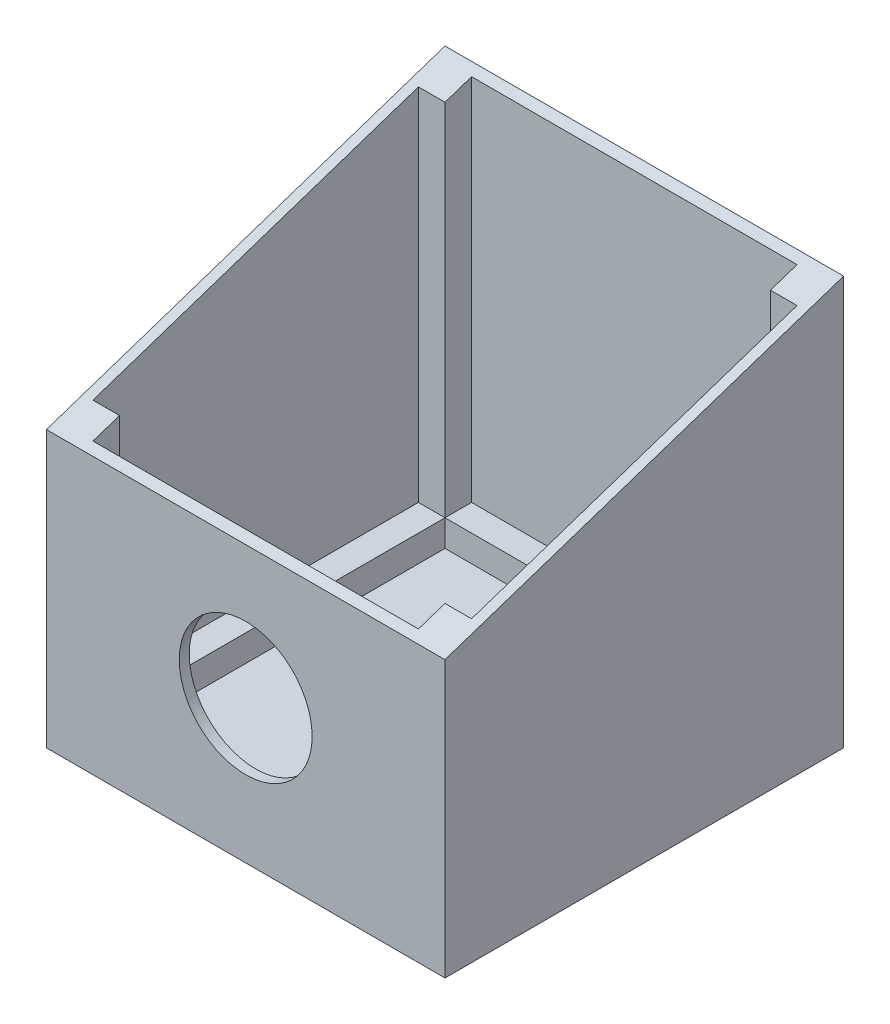
ISO-10303-21;
HEADER;
FILE_DESCRIPTION(('STEP AP214'),'2;1');
FILE_NAME('part.step','',(''),(''),'','','');
FILE_SCHEMA(('AUTOMOTIVE_DESIGN { 1 0 10303 214 1 1 1 1 }'));
ENDSEC;
DATA;
#1=APPLICATION_CONTEXT('core data for automotive mechanical design processes');
#2=APPLICATION_PROTOCOL_DEFINITION('international standard','automotive_design',2000,#1);
#3=PRODUCT_CONTEXT('',#1,'mechanical');
#4=PRODUCT('Part','Part','',(#3));
#5=PRODUCT_RELATED_PRODUCT_CATEGORY('part','',(#4));
#6=PRODUCT_DEFINITION_FORMATION('','',#4);
#7=PRODUCT_DEFINITION_CONTEXT('part definition',#1,'design');
#8=PRODUCT_DEFINITION('design','',#6,#7);
#9=PRODUCT_DEFINITION_SHAPE('','',#8);
#10=(LENGTH_UNIT() NAMED_UNIT(*) SI_UNIT(.MILLI.,.METRE.));
#11=(NAMED_UNIT(*) PLANE_ANGLE_UNIT() SI_UNIT($,.RADIAN.));
#12=(NAMED_UNIT(*) SI_UNIT($,.STERADIAN.) SOLID_ANGLE_UNIT());
#13=UNCERTAINTY_MEASURE_WITH_UNIT(LENGTH_MEASURE(1.E-05),#10,'distance_accuracy_value','');
#14=(GEOMETRIC_REPRESENTATION_CONTEXT(3) GLOBAL_UNCERTAINTY_ASSIGNED_CONTEXT((#13)) GLOBAL_UNIT_ASSIGNED_CONTEXT((#10,
#11,#12)) REPRESENTATION_CONTEXT('',''));
#15=CARTESIAN_POINT('',(0.,0.,0.));
#16=DIRECTION('',(0.,0.,1.));
#17=DIRECTION('',(1.,0.,0.));
#18=AXIS2_PLACEMENT_3D('',#15,#16,#17);
#19=CARTESIAN_POINT('',(0.,120.,-106.));
#20=DIRECTION('',(0.,0.,1.));
#21=DIRECTION('',(1.,0.,0.));
#22=AXIS2_PLACEMENT_3D('',#19,#20,#21);
#23=PLANE('',#22);
#24=DIRECTION('',(0.,-1.,0.));
#25=VECTOR('',#24,1.);
#26=CARTESIAN_POINT('',(7.99999999999999,8.,-106.));
#27=LINE('',#26,#25);
#28=CARTESIAN_POINT('',(7.99999999999999,7.99999999999999,-106.));
#29=VERTEX_POINT('',#28);
#30=CARTESIAN_POINT('',(7.99999999999999,0.,-106.));
#31=VERTEX_POINT('',#30);
#32=EDGE_CURVE('E173',#29,#31,#27,.T.);
#33=ORIENTED_EDGE('',*,*,#32,.T.);
#34=DIRECTION('',(-1.,0.,0.));
#35=VECTOR('',#34,1.);
#36=CARTESIAN_POINT('',(0.,0.,-106.));
#37=LINE('',#36,#35);
#38=CARTESIAN_POINT('',(106.,0.,-106.));
#39=VERTEX_POINT('',#38);
#40=EDGE_CURVE('E158',#39,#31,#37,.T.);
#41=ORIENTED_EDGE('',*,*,#40,.F.);
#42=DIRECTION('',(0.,-1.,0.));
#43=VECTOR('',#42,1.);
#44=CARTESIAN_POINT('',(106.,8.,-106.));
#45=LINE('',#44,#43);
#46=CARTESIAN_POINT('',(106.,8.00000000000001,-106.));
#47=VERTEX_POINT('',#46);
#48=EDGE_CURVE('E207',#47,#39,#45,.T.);
#49=ORIENTED_EDGE('',*,*,#48,.F.);
#50=DIRECTION('',(-1.,0.,0.));
#51=VECTOR('',#50,1.);
#52=CARTESIAN_POINT('',(0.,8.,-106.));
#53=LINE('',#52,#51);
#54=EDGE_CURVE('E175',#47,#29,#53,.T.);
#55=ORIENTED_EDGE('',*,*,#54,.T.);
#56=EDGE_LOOP('',(#33,#41,#49,#55));
#57=FACE_BOUND('',#56,.T.);
#58=ADVANCED_FACE('F32',(#57),#23,.T.);
#59=CARTESIAN_POINT('',(0.,120.,-7.99999999999999));
#60=DIRECTION('',(0.,0.,-1.));
#61=DIRECTION('',(-1.,0.,0.));
#62=AXIS2_PLACEMENT_3D('',#59,#60,#61);
#63=PLANE('',#62);
#64=DIRECTION('',(0.,-1.,0.));
#65=VECTOR('',#64,1.);
#66=CARTESIAN_POINT('',(8.,8.,-7.99999999999999));
#67=LINE('',#66,#65);
#68=CARTESIAN_POINT('',(8.,8.00000000000001,-7.99999999999999));
#69=VERTEX_POINT('',#68);
#70=CARTESIAN_POINT('',(7.99999999999999,0.,-7.99999999999999));
#71=VERTEX_POINT('',#70);
#72=EDGE_CURVE('E179',#69,#71,#67,.T.);
#73=ORIENTED_EDGE('',*,*,#72,.F.);
#74=DIRECTION('',(1.,0.,0.));
#75=VECTOR('',#74,1.);
#76=CARTESIAN_POINT('',(0.,8.,-7.99999999999998));
#77=LINE('',#76,#75);
#78=CARTESIAN_POINT('',(106.,8.00000000000001,-8.));
#79=VERTEX_POINT('',#78);
#80=EDGE_CURVE('E183',#69,#79,#77,.T.);
#81=ORIENTED_EDGE('',*,*,#80,.T.);
#82=DIRECTION('',(0.,-1.,0.));
#83=VECTOR('',#82,1.);
#84=CARTESIAN_POINT('',(106.,8.,-8.));
#85=LINE('',#84,#83);
#86=CARTESIAN_POINT('',(106.,0.,-8.));
#87=VERTEX_POINT('',#86);
#88=EDGE_CURVE('E187',#79,#87,#85,.T.);
#89=ORIENTED_EDGE('',*,*,#88,.T.);
#90=DIRECTION('',(1.,0.,0.));
#91=VECTOR('',#90,1.);
#92=CARTESIAN_POINT('',(0.,0.,-7.99999999999999));
#93=LINE('',#92,#91);
#94=EDGE_CURVE('E168',#71,#87,#93,.T.);
#95=ORIENTED_EDGE('',*,*,#94,.F.);
#96=EDGE_LOOP('',(#73,#81,#89,#95));
#97=FACE_BOUND('',#96,.T.);
#98=ADVANCED_FACE('F354',(#97),#63,.T.);
#99=CARTESIAN_POINT('',(106.,120.,0.));
#100=DIRECTION('',(-1.,0.,0.));
#101=DIRECTION('',(0.,0.,1.));
#102=AXIS2_PLACEMENT_3D('',#99,#100,#101);
#103=PLANE('',#102);
#104=ORIENTED_EDGE('',*,*,#88,.F.);
#105=DIRECTION('',(0.,0.,-1.));
#106=VECTOR('',#105,1.);
#107=CARTESIAN_POINT('',(106.,8.,0.));
#108=LINE('',#107,#106);
#109=EDGE_CURVE('E201',#79,#47,#108,.T.);
#110=ORIENTED_EDGE('',*,*,#109,.T.);
#111=ORIENTED_EDGE('',*,*,#48,.T.);
#112=DIRECTION('',(0.,0.,-1.));
#113=VECTOR('',#112,1.);
#114=CARTESIAN_POINT('',(106.,0.,0.));
#115=LINE('',#114,#113);
#116=EDGE_CURVE('E165',#87,#39,#115,.T.);
#117=ORIENTED_EDGE('',*,*,#116,.F.);
#118=EDGE_LOOP('',(#104,#110,#111,#117));
#119=FACE_BOUND('',#118,.T.);
#120=ADVANCED_FACE('F361',(#119),#103,.T.);
#121=DIRECTION('',(-1.,0.,0.));
#122=VECTOR('',#121,1.);
#123=CARTESIAN_POINT('',(0.,8.,-106.));
#124=LINE('',#123,#122);
#125=CARTESIAN_POINT('',(0.,8.00000000000001,-106.));
#126=VERTEX_POINT('',#125);
#127=EDGE_CURVE('E184',#29,#126,#124,.T.);
#128=ORIENTED_EDGE('',*,*,#127,.F.);
#129=DIRECTION('',(0.,-1.,0.));
#130=VECTOR('',#129,1.);
#131=CARTESIAN_POINT('',(7.99999999999999,120.,-106.));
#132=LINE('',#131,#130);
#133=CARTESIAN_POINT('',(7.99999999999999,116.333333333333,-106.));
#134=VERTEX_POINT('',#133);
#135=EDGE_CURVE('E309',#134,#29,#132,.T.);
#136=ORIENTED_EDGE('',*,*,#135,.F.);
#137=DIRECTION('',(1.,0.,0.));
#138=VECTOR('',#137,1.);
#139=CARTESIAN_POINT('',(0.,116.333333333333,-106.));
#140=LINE('',#139,#138);
#141=CARTESIAN_POINT('',(0.,116.333333333333,-106.));
#142=VERTEX_POINT('',#141);
#143=EDGE_CURVE('E268',#142,#134,#140,.T.);
#144=ORIENTED_EDGE('',*,*,#143,.F.);
#145=DIRECTION('',(0.,-1.,0.));
#146=VECTOR('',#145,1.);
#147=CARTESIAN_POINT('',(0.,120.,-106.));
#148=LINE('',#147,#146);
#149=EDGE_CURVE('E307',#142,#126,#148,.T.);
#150=ORIENTED_EDGE('',*,*,#149,.T.);
#151=EDGE_LOOP('',(#128,#136,#144,#150));
#152=FACE_BOUND('',#151,.T.);
#153=ADVANCED_FACE('F356',(#152),#23,.T.);
#154=CARTESIAN_POINT('',(-3.,120.,3.));
#155=DIRECTION('',(0.,0.,-1.));
#156=DIRECTION('',(-1.,0.,0.));
#157=AXIS2_PLACEMENT_3D('',#154,#155,#156);
#158=PLANE('',#157);
#159=DIRECTION('',(0.,-1.,0.));
#160=VECTOR('',#159,1.);
#161=CARTESIAN_POINT('',(117.,120.,3.));
#162=LINE('',#161,#160);
#163=CARTESIAN_POINT('',(117.,80.,3.));
#164=VERTEX_POINT('',#163);
#165=CARTESIAN_POINT('',(117.,-3.,3.));
#166=VERTEX_POINT('',#165);
#167=EDGE_CURVE('E318',#164,#166,#162,.T.);
#168=ORIENTED_EDGE('',*,*,#167,.F.);
#169=DIRECTION('',(1.,0.,0.));
#170=VECTOR('',#169,1.);
#171=CARTESIAN_POINT('',(-120.,80.,3.));
#172=LINE('',#171,#170);
#173=CARTESIAN_POINT('',(-3.,80.,3.));
#174=VERTEX_POINT('',#173);
#175=EDGE_CURVE('E248',#174,#164,#172,.T.);
#176=ORIENTED_EDGE('',*,*,#175,.F.);
#177=DIRECTION('',(0.,-1.,0.));
#178=VECTOR('',#177,1.);
#179=CARTESIAN_POINT('',(-3.,120.,3.));
#180=LINE('',#179,#178);
#181=CARTESIAN_POINT('',(-3.,-3.,3.));
#182=VERTEX_POINT('',#181);
#183=EDGE_CURVE('E40',#174,#182,#180,.T.);
#184=ORIENTED_EDGE('',*,*,#183,.T.);
#185=DIRECTION('',(1.,0.,0.));
#186=VECTOR('',#185,1.);
#187=CARTESIAN_POINT('',(-3.,-3.,3.));
#188=LINE('',#187,#186);
#189=EDGE_CURVE('E239',#182,#166,#188,.T.);
#190=ORIENTED_EDGE('',*,*,#189,.T.);
#191=EDGE_LOOP('',(#168,#176,#184,#190));
#192=FACE_BOUND('',#191,.T.);
#193=CARTESIAN_POINT('',(57.,40.,3.));
#194=DIRECTION('',(0.,0.,-1.));
#195=DIRECTION('',(-1.,0.,0.));
#196=AXIS2_PLACEMENT_3D('',#193,#194,#195);
#197=CIRCLE('',#196,20.);
#198=CARTESIAN_POINT('',(37.,40.,3.));
#199=VERTEX_POINT('',#198);
#200=EDGE_CURVE('E245',#199,#199,#197,.F.);
#201=ORIENTED_EDGE('',*,*,#200,.F.);
#202=EDGE_LOOP('',(#201));
#203=FACE_BOUND('',#202,.T.);
#204=ADVANCED_FACE('F323',(#192,#203),#158,.F.);
#205=CARTESIAN_POINT('',(8.,120.,0.));
#206=DIRECTION('',(0.,0.,-1.));
#207=DIRECTION('',(-1.,0.,0.));
#208=AXIS2_PLACEMENT_3D('',#205,#206,#207);
#209=PLANE('',#208);
#210=DIRECTION('',(1.,0.,0.));
#211=VECTOR('',#210,1.);
#212=CARTESIAN_POINT('',(0.,8.,0.));
#213=LINE('',#212,#211);
#214=CARTESIAN_POINT('',(8.,8.00000000000001,0.));
#215=VERTEX_POINT('',#214);
#216=CARTESIAN_POINT('',(106.,8.00000000000001,0.));
#217=VERTEX_POINT('',#216);
#218=EDGE_CURVE('E202',#215,#217,#213,.T.);
#219=ORIENTED_EDGE('',*,*,#218,.F.);
#220=DIRECTION('',(0.,-1.,0.));
#221=VECTOR('',#220,1.);
#222=CARTESIAN_POINT('',(8.,120.,0.));
#223=LINE('',#222,#221);
#224=CARTESIAN_POINT('',(8.,81.,0.));
#225=VERTEX_POINT('',#224);
#226=EDGE_CURVE('E300',#225,#215,#223,.T.);
#227=ORIENTED_EDGE('',*,*,#226,.F.);
#228=DIRECTION('',(-1.,0.,0.));
#229=VECTOR('',#228,1.);
#230=CARTESIAN_POINT('',(8.,81.,0.));
#231=LINE('',#230,#229);
#232=CARTESIAN_POINT('',(106.,81.,0.));
#233=VERTEX_POINT('',#232);
#234=EDGE_CURVE('E260',#233,#225,#231,.T.);
#235=ORIENTED_EDGE('',*,*,#234,.F.);
#236=DIRECTION('',(0.,-1.,0.));
#237=VECTOR('',#236,1.);
#238=CARTESIAN_POINT('',(106.,120.,0.));
#239=LINE('',#238,#237);
#240=EDGE_CURVE('E297',#233,#217,#239,.T.);
#241=ORIENTED_EDGE('',*,*,#240,.T.);
#242=EDGE_LOOP('',(#219,#227,#235,#241));
#243=FACE_BOUND('',#242,.T.);
#244=CARTESIAN_POINT('',(57.,40.,0.));
#245=DIRECTION('',(0.,0.,1.));
#246=DIRECTION('',(1.,0.,0.));
#247=AXIS2_PLACEMENT_3D('',#244,#245,#246);
#248=CIRCLE('',#247,20.);
#249=CARTESIAN_POINT('',(77.,40.,0.));
#250=VERTEX_POINT('',#249);
#251=EDGE_CURVE('E242',#250,#250,#248,.T.);
#252=ORIENTED_EDGE('',*,*,#251,.T.);
#253=EDGE_LOOP('',(#252));
#254=FACE_BOUND('',#253,.T.);
#255=ADVANCED_FACE('F398',(#243,#254),#209,.T.);
#256=CARTESIAN_POINT('',(-3.,120.,3.));
#257=DIRECTION('',(1.,0.,0.));
#258=DIRECTION('',(0.,0.,-1.));
#259=AXIS2_PLACEMENT_3D('',#256,#257,#258);
#260=PLANE('',#259);
#261=ORIENTED_EDGE('',*,*,#183,.F.);
#262=DIRECTION('',(0.,0.316227766016838,-0.948683298050514));
#263=VECTOR('',#262,1.);
#264=CARTESIAN_POINT('',(-3.,84.,-8.99999999999999));
#265=LINE('',#264,#263);
#266=CARTESIAN_POINT('',(-3.,120.,-117.));
#267=VERTEX_POINT('',#266);
#268=EDGE_CURVE('E169',#174,#267,#265,.T.);
#269=ORIENTED_EDGE('',*,*,#268,.T.);
#270=DIRECTION('',(0.,-1.,0.));
#271=VECTOR('',#270,1.);
#272=CARTESIAN_POINT('',(-3.,120.,-117.));
#273=LINE('',#272,#271);
#274=CARTESIAN_POINT('',(-3.,-3.,-117.));
#275=VERTEX_POINT('',#274);
#276=EDGE_CURVE('E314',#267,#275,#273,.T.);
#277=ORIENTED_EDGE('',*,*,#276,.T.);
#278=DIRECTION('',(0.,0.,1.));
#279=VECTOR('',#278,1.);
#280=CARTESIAN_POINT('',(-3.,-3.,-117.));
#281=LINE('',#280,#279);
#282=EDGE_CURVE('E236',#275,#182,#281,.T.);
#283=ORIENTED_EDGE('',*,*,#282,.T.);
#284=EDGE_LOOP('',(#261,#269,#277,#283));
#285=FACE_BOUND('',#284,.T.);
#286=ADVANCED_FACE('F34',(#285),#260,.F.);
#287=CARTESIAN_POINT('',(117.,120.,3.));
#288=DIRECTION('',(-1.,0.,0.));
#289=DIRECTION('',(0.,0.,1.));
#290=AXIS2_PLACEMENT_3D('',#287,#288,#289);
#291=PLANE('',#290);
#292=DIRECTION('',(0.,-1.,0.));
#293=VECTOR('',#292,1.);
#294=CARTESIAN_POINT('',(117.,120.,-117.));
#295=LINE('',#294,#293);
#296=CARTESIAN_POINT('',(117.,120.,-117.));
#297=VERTEX_POINT('',#296);
#298=CARTESIAN_POINT('',(117.,-3.,-117.));
#299=VERTEX_POINT('',#298);
#300=EDGE_CURVE('E316',#297,#299,#295,.T.);
#301=ORIENTED_EDGE('',*,*,#300,.F.);
#302=DIRECTION('',(0.,-0.316227766016838,0.948683298050514));
#303=VECTOR('',#302,1.);
#304=CARTESIAN_POINT('',(117.,84.,-8.99999999999999));
#305=LINE('',#304,#303);
#306=EDGE_CURVE('E272',#297,#164,#305,.T.);
#307=ORIENTED_EDGE('',*,*,#306,.T.);
#308=ORIENTED_EDGE('',*,*,#167,.T.);
#309=DIRECTION('',(0.,0.,-1.));
#310=VECTOR('',#309,1.);
#311=CARTESIAN_POINT('',(117.,-3.,3.));
#312=LINE('',#311,#310);
#313=EDGE_CURVE('E230',#166,#299,#312,.T.);
#314=ORIENTED_EDGE('',*,*,#313,.T.);
#315=EDGE_LOOP('',(#301,#307,#308,#314));
#316=FACE_BOUND('',#315,.T.);
#317=ADVANCED_FACE('F335',(#316),#291,.F.);
#318=CARTESIAN_POINT('',(-3.,120.,-117.));
#319=DIRECTION('',(0.,0.,1.));
#320=DIRECTION('',(1.,0.,0.));
#321=AXIS2_PLACEMENT_3D('',#318,#319,#320);
#322=PLANE('',#321);
#323=ORIENTED_EDGE('',*,*,#300,.T.);
#324=DIRECTION('',(-1.,0.,0.));
#325=VECTOR('',#324,1.);
#326=CARTESIAN_POINT('',(117.,-3.,-117.));
#327=LINE('',#326,#325);
#328=EDGE_CURVE('E233',#299,#275,#327,.T.);
#329=ORIENTED_EDGE('',*,*,#328,.T.);
#330=ORIENTED_EDGE('',*,*,#276,.F.);
#331=DIRECTION('',(-1.,0.,0.));
#332=VECTOR('',#331,1.);
#333=CARTESIAN_POINT('',(-3.,120.,-117.));
#334=LINE('',#333,#332);
#335=EDGE_CURVE('E312',#297,#267,#334,.T.);
#336=ORIENTED_EDGE('',*,*,#335,.F.);
#337=EDGE_LOOP('',(#323,#329,#330,#336));
#338=FACE_BOUND('',#337,.T.);
#339=ADVANCED_FACE('F340',(#338),#322,.F.);
#340=CARTESIAN_POINT('',(8.,120.,-114.));
#341=DIRECTION('',(1.,0.,0.));
#342=DIRECTION('',(0.,0.,-1.));
#343=AXIS2_PLACEMENT_3D('',#340,#341,#342);
#344=PLANE('',#343);
#345=DIRECTION('',(0.,0.,1.));
#346=VECTOR('',#345,1.);
#347=CARTESIAN_POINT('',(7.9999999999998,8.,0.));
#348=LINE('',#347,#346);
#349=CARTESIAN_POINT('',(8.,8.00000000000001,-114.));
#350=VERTEX_POINT('',#349);
#351=EDGE_CURVE('E223',#350,#29,#348,.T.);
#352=ORIENTED_EDGE('',*,*,#351,.F.);
#353=DIRECTION('',(0.,-1.,0.));
#354=VECTOR('',#353,1.);
#355=CARTESIAN_POINT('',(8.,120.,-114.));
#356=LINE('',#355,#354);
#357=CARTESIAN_POINT('',(8.,119.,-114.));
#358=VERTEX_POINT('',#357);
#359=EDGE_CURVE('E279',#358,#350,#356,.T.);
#360=ORIENTED_EDGE('',*,*,#359,.F.);
#361=DIRECTION('',(0.,0.316227766016838,-0.948683298050514));
#362=VECTOR('',#361,1.);
#363=CARTESIAN_POINT('',(8.,119.1,-114.3));
#364=LINE('',#363,#362);
#365=EDGE_CURVE('E270',#134,#358,#364,.T.);
#366=ORIENTED_EDGE('',*,*,#365,.F.);
#367=ORIENTED_EDGE('',*,*,#135,.T.);
#368=EDGE_LOOP('',(#352,#360,#366,#367));
#369=FACE_BOUND('',#368,.T.);
#370=ADVANCED_FACE('F342',(#369),#344,.T.);
#371=DIRECTION('',(-1.,0.,0.));
#372=VECTOR('',#371,1.);
#373=CARTESIAN_POINT('',(0.,8.,-106.));
#374=LINE('',#373,#372);
#375=CARTESIAN_POINT('',(114.,8.00000000000001,-106.));
#376=VERTEX_POINT('',#375);
#377=EDGE_CURVE('E214',#376,#47,#374,.T.);
#378=ORIENTED_EDGE('',*,*,#377,.F.);
#379=DIRECTION('',(0.,-1.,0.));
#380=VECTOR('',#379,1.);
#381=CARTESIAN_POINT('',(114.,120.,-106.));
#382=LINE('',#381,#380);
#383=CARTESIAN_POINT('',(114.,116.333333333333,-106.));
#384=VERTEX_POINT('',#383);
#385=EDGE_CURVE('E288',#384,#376,#382,.T.);
#386=ORIENTED_EDGE('',*,*,#385,.F.);
#387=DIRECTION('',(1.,0.,0.));
#388=VECTOR('',#387,1.);
#389=CARTESIAN_POINT('',(114.,116.333333333333,-106.));
#390=LINE('',#389,#388);
#391=CARTESIAN_POINT('',(106.,116.333333333333,-106.));
#392=VERTEX_POINT('',#391);
#393=EDGE_CURVE('E252',#392,#384,#390,.T.);
#394=ORIENTED_EDGE('',*,*,#393,.F.);
#395=DIRECTION('',(0.,-1.,0.));
#396=VECTOR('',#395,1.);
#397=CARTESIAN_POINT('',(106.,120.,-106.));
#398=LINE('',#397,#396);
#399=EDGE_CURVE('E285',#392,#47,#398,.T.);
#400=ORIENTED_EDGE('',*,*,#399,.T.);
#401=EDGE_LOOP('',(#378,#386,#394,#400));
#402=FACE_BOUND('',#401,.T.);
#403=ADVANCED_FACE('F349',(#402),#23,.T.);
#404=CARTESIAN_POINT('',(0.,120.,-7.99999999999999));
#405=DIRECTION('',(1.,0.,0.));
#406=DIRECTION('',(0.,0.,-1.));
#407=AXIS2_PLACEMENT_3D('',#404,#405,#406);
#408=PLANE('',#407);
#409=DIRECTION('',(0.,0.,1.));
#410=VECTOR('',#409,1.);
#411=CARTESIAN_POINT('',(0.,8.,0.));
#412=LINE('',#411,#410);
#413=CARTESIAN_POINT('',(0.,8.00000000000001,-7.99999999999999));
#414=VERTEX_POINT('',#413);
#415=EDGE_CURVE('E47',#126,#414,#412,.T.);
#416=ORIENTED_EDGE('',*,*,#415,.F.);
#417=ORIENTED_EDGE('',*,*,#149,.F.);
#418=DIRECTION('',(0.,0.316227766016838,-0.948683298050514));
#419=VECTOR('',#418,1.);
#420=CARTESIAN_POINT('',(0.,87.3,-18.9));
#421=LINE('',#420,#419);
#422=CARTESIAN_POINT('',(0.,83.6666666666667,-7.99999999999999));
#423=VERTEX_POINT('',#422);
#424=EDGE_CURVE('E266',#423,#142,#421,.T.);
#425=ORIENTED_EDGE('',*,*,#424,.F.);
#426=DIRECTION('',(0.,-1.,0.));
#427=VECTOR('',#426,1.);
#428=CARTESIAN_POINT('',(0.,120.,-7.99999999999999));
#429=LINE('',#428,#427);
#430=EDGE_CURVE('E305',#423,#414,#429,.T.);
#431=ORIENTED_EDGE('',*,*,#430,.T.);
#432=EDGE_LOOP('',(#416,#417,#425,#431));
#433=FACE_BOUND('',#432,.T.);
#434=ADVANCED_FACE('F368',(#433),#408,.T.);
#435=DIRECTION('',(1.,0.,0.));
#436=VECTOR('',#435,1.);
#437=CARTESIAN_POINT('',(0.,8.,-7.99999999999999));
#438=LINE('',#437,#436);
#439=EDGE_CURVE('E55',#414,#69,#438,.T.);
#440=ORIENTED_EDGE('',*,*,#439,.F.);
#441=ORIENTED_EDGE('',*,*,#430,.F.);
#442=DIRECTION('',(-1.,0.,0.));
#443=VECTOR('',#442,1.);
#444=CARTESIAN_POINT('',(0.,83.6666666666667,-7.99999999999999));
#445=LINE('',#444,#443);
#446=CARTESIAN_POINT('',(8.,83.6666666666667,-7.99999999999999));
#447=VERTEX_POINT('',#446);
#448=EDGE_CURVE('E264',#447,#423,#445,.T.);
#449=ORIENTED_EDGE('',*,*,#448,.F.);
#450=DIRECTION('',(0.,-1.,0.));
#451=VECTOR('',#450,1.);
#452=CARTESIAN_POINT('',(8.,120.,-7.99999999999999));
#453=LINE('',#452,#451);
#454=EDGE_CURVE('E303',#447,#69,#453,.T.);
#455=ORIENTED_EDGE('',*,*,#454,.T.);
#456=EDGE_LOOP('',(#440,#441,#449,#455));
#457=FACE_BOUND('',#456,.T.);
#458=ADVANCED_FACE('F364',(#457),#63,.T.);
#459=CARTESIAN_POINT('',(8.,120.,0.));
#460=DIRECTION('',(1.,0.,0.));
#461=DIRECTION('',(0.,0.,-1.));
#462=AXIS2_PLACEMENT_3D('',#459,#460,#461);
#463=PLANE('',#462);
#464=DIRECTION('',(0.,0.,1.));
#465=VECTOR('',#464,1.);
#466=CARTESIAN_POINT('',(8.,8.,0.));
#467=LINE('',#466,#465);
#468=EDGE_CURVE('E197',#69,#215,#467,.T.);
#469=ORIENTED_EDGE('',*,*,#468,.F.);
#470=ORIENTED_EDGE('',*,*,#454,.F.);
#471=DIRECTION('',(0.,0.316227766016838,-0.948683298050514));
#472=VECTOR('',#471,1.);
#473=CARTESIAN_POINT('',(8.,84.9,-11.7));
#474=LINE('',#473,#472);
#475=EDGE_CURVE('E262',#225,#447,#474,.T.);
#476=ORIENTED_EDGE('',*,*,#475,.F.);
#477=ORIENTED_EDGE('',*,*,#226,.T.);
#478=EDGE_LOOP('',(#469,#470,#476,#477));
#479=FACE_BOUND('',#478,.T.);
#480=ADVANCED_FACE('F402',(#479),#463,.T.);
#481=DIRECTION('',(0.,0.,-1.));
#482=VECTOR('',#481,1.);
#483=CARTESIAN_POINT('',(106.,8.,0.));
#484=LINE('',#483,#482);
#485=EDGE_CURVE('E198',#217,#79,#484,.T.);
#486=ORIENTED_EDGE('',*,*,#485,.F.);
#487=ORIENTED_EDGE('',*,*,#240,.F.);
#488=DIRECTION('',(0.,-0.316227766016838,0.948683298050514));
#489=VECTOR('',#488,1.);
#490=CARTESIAN_POINT('',(106.,84.9,-11.7));
#491=LINE('',#490,#489);
#492=CARTESIAN_POINT('',(106.,83.6666666666667,-8.));
#493=VERTEX_POINT('',#492);
#494=EDGE_CURVE('E258',#493,#233,#491,.T.);
#495=ORIENTED_EDGE('',*,*,#494,.F.);
#496=DIRECTION('',(0.,-1.,0.));
#497=VECTOR('',#496,1.);
#498=CARTESIAN_POINT('',(106.,120.,-8.));
#499=LINE('',#498,#497);
#500=EDGE_CURVE('E294',#493,#79,#499,.T.);
#501=ORIENTED_EDGE('',*,*,#500,.T.);
#502=EDGE_LOOP('',(#486,#487,#495,#501));
#503=FACE_BOUND('',#502,.T.);
#504=ADVANCED_FACE('F391',(#503),#103,.T.);
#505=CARTESIAN_POINT('',(114.,120.,-8.));
#506=DIRECTION('',(0.,0.,-1.));
#507=DIRECTION('',(-1.,0.,0.));
#508=AXIS2_PLACEMENT_3D('',#505,#506,#507);
#509=PLANE('',#508);
#510=DIRECTION('',(1.,0.,0.));
#511=VECTOR('',#510,1.);
#512=CARTESIAN_POINT('',(0.,8.,-8.));
#513=LINE('',#512,#511);
#514=CARTESIAN_POINT('',(114.,8.00000000000001,-8.));
#515=VERTEX_POINT('',#514);
#516=EDGE_CURVE('E210',#79,#515,#513,.T.);
#517=ORIENTED_EDGE('',*,*,#516,.F.);
#518=ORIENTED_EDGE('',*,*,#500,.F.);
#519=DIRECTION('',(-1.,0.,0.));
#520=VECTOR('',#519,1.);
#521=CARTESIAN_POINT('',(114.,83.6666666666667,-8.));
#522=LINE('',#521,#520);
#523=CARTESIAN_POINT('',(114.,83.6666666666667,-8.));
#524=VERTEX_POINT('',#523);
#525=EDGE_CURVE('E256',#524,#493,#522,.T.);
#526=ORIENTED_EDGE('',*,*,#525,.F.);
#527=DIRECTION('',(0.,-1.,0.));
#528=VECTOR('',#527,1.);
#529=CARTESIAN_POINT('',(114.,120.,-8.));
#530=LINE('',#529,#528);
#531=EDGE_CURVE('E291',#524,#515,#530,.T.);
#532=ORIENTED_EDGE('',*,*,#531,.T.);
#533=EDGE_LOOP('',(#517,#518,#526,#532));
#534=FACE_BOUND('',#533,.T.);
#535=ADVANCED_FACE('F387',(#534),#509,.T.);
#536=CARTESIAN_POINT('',(114.,120.,-8.));
#537=DIRECTION('',(-1.,0.,0.));
#538=DIRECTION('',(0.,0.,1.));
#539=AXIS2_PLACEMENT_3D('',#536,#537,#538);
#540=PLANE('',#539);
#541=DIRECTION('',(0.,0.,-1.));
#542=VECTOR('',#541,1.);
#543=CARTESIAN_POINT('',(114.,8.,0.));
#544=LINE('',#543,#542);
#545=EDGE_CURVE('E209',#515,#376,#544,.T.);
#546=ORIENTED_EDGE('',*,*,#545,.F.);
#547=ORIENTED_EDGE('',*,*,#531,.F.);
#548=DIRECTION('',(0.,-0.316227766016838,0.948683298050514));
#549=VECTOR('',#548,1.);
#550=CARTESIAN_POINT('',(114.,87.3,-18.9));
#551=LINE('',#550,#549);
#552=EDGE_CURVE('E254',#384,#524,#551,.T.);
#553=ORIENTED_EDGE('',*,*,#552,.F.);
#554=ORIENTED_EDGE('',*,*,#385,.T.);
#555=EDGE_LOOP('',(#546,#547,#553,#554));
#556=FACE_BOUND('',#555,.T.);
#557=ADVANCED_FACE('F381',(#556),#540,.T.);
#558=CARTESIAN_POINT('',(106.,120.,-114.));
#559=DIRECTION('',(-1.,0.,0.));
#560=DIRECTION('',(0.,0.,1.));
#561=AXIS2_PLACEMENT_3D('',#558,#559,#560);
#562=PLANE('',#561);
#563=DIRECTION('',(0.,0.,-1.));
#564=VECTOR('',#563,1.);
#565=CARTESIAN_POINT('',(106.,8.,0.));
#566=LINE('',#565,#564);
#567=CARTESIAN_POINT('',(106.,8.00000000000001,-114.));
#568=VERTEX_POINT('',#567);
#569=EDGE_CURVE('E227',#47,#568,#566,.T.);
#570=ORIENTED_EDGE('',*,*,#569,.F.);
#571=ORIENTED_EDGE('',*,*,#399,.F.);
#572=DIRECTION('',(0.,-0.316227766016838,0.948683298050514));
#573=VECTOR('',#572,1.);
#574=CARTESIAN_POINT('',(106.,119.1,-114.3));
#575=LINE('',#574,#573);
#576=CARTESIAN_POINT('',(106.,119.,-114.));
#577=VERTEX_POINT('',#576);
#578=EDGE_CURVE('E250',#577,#392,#575,.T.);
#579=ORIENTED_EDGE('',*,*,#578,.F.);
#580=DIRECTION('',(0.,-1.,0.));
#581=VECTOR('',#580,1.);
#582=CARTESIAN_POINT('',(106.,120.,-114.));
#583=LINE('',#582,#581);
#584=EDGE_CURVE('E282',#577,#568,#583,.T.);
#585=ORIENTED_EDGE('',*,*,#584,.T.);
#586=EDGE_LOOP('',(#570,#571,#579,#585));
#587=FACE_BOUND('',#586,.T.);
#588=ADVANCED_FACE('F424',(#587),#562,.T.);
#589=CARTESIAN_POINT('',(8.,120.,-114.));
#590=DIRECTION('',(0.,0.,1.));
#591=DIRECTION('',(1.,0.,0.));
#592=AXIS2_PLACEMENT_3D('',#589,#590,#591);
#593=PLANE('',#592);
#594=DIRECTION('',(-1.,0.,0.));
#595=VECTOR('',#594,1.);
#596=CARTESIAN_POINT('',(0.,8.,-114.));
#597=LINE('',#596,#595);
#598=EDGE_CURVE('E213',#568,#350,#597,.T.);
#599=ORIENTED_EDGE('',*,*,#598,.F.);
#600=ORIENTED_EDGE('',*,*,#584,.F.);
#601=DIRECTION('',(1.,0.,0.));
#602=VECTOR('',#601,1.);
#603=CARTESIAN_POINT('',(8.,119.,-114.));
#604=LINE('',#603,#602);
#605=EDGE_CURVE('E11',#358,#577,#604,.T.);
#606=ORIENTED_EDGE('',*,*,#605,.F.);
#607=ORIENTED_EDGE('',*,*,#359,.T.);
#608=EDGE_LOOP('',(#599,#600,#606,#607));
#609=FACE_BOUND('',#608,.T.);
#610=ADVANCED_FACE('F420',(#609),#593,.T.);
#611=CARTESIAN_POINT('',(-120.,120.,-117.));
#612=DIRECTION('',(0.,-0.948683298050514,-0.316227766016838));
#613=DIRECTION('',(0.,0.316227766016838,-0.948683298050514));
#614=AXIS2_PLACEMENT_3D('',#611,#612,#613);
#615=PLANE('',#614);
#616=ORIENTED_EDGE('',*,*,#365,.T.);
#617=ORIENTED_EDGE('',*,*,#605,.T.);
#618=ORIENTED_EDGE('',*,*,#578,.T.);
#619=ORIENTED_EDGE('',*,*,#393,.T.);
#620=ORIENTED_EDGE('',*,*,#552,.T.);
#621=ORIENTED_EDGE('',*,*,#525,.T.);
#622=ORIENTED_EDGE('',*,*,#494,.T.);
#623=ORIENTED_EDGE('',*,*,#234,.T.);
#624=ORIENTED_EDGE('',*,*,#475,.T.);
#625=ORIENTED_EDGE('',*,*,#448,.T.);
#626=ORIENTED_EDGE('',*,*,#424,.T.);
#627=ORIENTED_EDGE('',*,*,#143,.T.);
#628=EDGE_LOOP('',(#616,#617,#618,#619,#620,#621,#622,#623,#624,#625,#626,#627));
#629=FACE_BOUND('',#628,.T.);
#630=ORIENTED_EDGE('',*,*,#175,.T.);
#631=ORIENTED_EDGE('',*,*,#306,.F.);
#632=ORIENTED_EDGE('',*,*,#335,.T.);
#633=ORIENTED_EDGE('',*,*,#268,.F.);
#634=EDGE_LOOP('',(#630,#631,#632,#633));
#635=FACE_BOUND('',#634,.T.);
#636=ADVANCED_FACE('F338',(#629,#635),#615,.F.);
#637=CARTESIAN_POINT('',(57.,40.,120.));
#638=DIRECTION('',(0.,0.,-1.));
#639=DIRECTION('',(-1.,0.,0.));
#640=AXIS2_PLACEMENT_3D('',#637,#638,#639);
#641=CYLINDRICAL_SURFACE('',#640,20.);
#642=ORIENTED_EDGE('',*,*,#251,.F.);
#643=EDGE_LOOP('',(#642));
#644=FACE_BOUND('',#643,.T.);
#645=ORIENTED_EDGE('',*,*,#200,.T.);
#646=EDGE_LOOP('',(#645));
#647=FACE_BOUND('',#646,.T.);
#648=ADVANCED_FACE('F446',(#644,#647),#641,.F.);
#649=CARTESIAN_POINT('',(0.,0.,0.));
#650=DIRECTION('',(0.,1.,0.));
#651=DIRECTION('',(0.,0.,1.));
#652=AXIS2_PLACEMENT_3D('',#649,#650,#651);
#653=PLANE('',#652);
#654=DIRECTION('',(0.,0.,1.));
#655=VECTOR('',#654,1.);
#656=CARTESIAN_POINT('',(8.,0.,0.));
#657=LINE('',#656,#655);
#658=EDGE_CURVE('E162',#31,#71,#657,.T.);
#659=ORIENTED_EDGE('',*,*,#658,.T.);
#660=ORIENTED_EDGE('',*,*,#94,.T.);
#661=ORIENTED_EDGE('',*,*,#116,.T.);
#662=ORIENTED_EDGE('',*,*,#40,.T.);
#663=EDGE_LOOP('',(#659,#660,#661,#662));
#664=FACE_BOUND('',#663,.T.);
#665=ADVANCED_FACE('F160',(#664),#653,.T.);
#666=CARTESIAN_POINT('',(0.,-3.,0.));
#667=DIRECTION('',(0.,1.,0.));
#668=DIRECTION('',(0.,0.,1.));
#669=AXIS2_PLACEMENT_3D('',#666,#667,#668);
#670=PLANE('',#669);
#671=ORIENTED_EDGE('',*,*,#313,.F.);
#672=ORIENTED_EDGE('',*,*,#189,.F.);
#673=ORIENTED_EDGE('',*,*,#282,.F.);
#674=ORIENTED_EDGE('',*,*,#328,.F.);
#675=EDGE_LOOP('',(#671,#672,#673,#674));
#676=FACE_BOUND('',#675,.T.);
#677=ADVANCED_FACE('F332',(#676),#670,.F.);
#678=CARTESIAN_POINT('',(0.,8.,0.));
#679=DIRECTION('',(0.,1.,0.));
#680=DIRECTION('',(0.,0.,1.));
#681=AXIS2_PLACEMENT_3D('',#678,#679,#680);
#682=PLANE('',#681);
#683=ORIENTED_EDGE('',*,*,#598,.T.);
#684=ORIENTED_EDGE('',*,*,#351,.T.);
#685=ORIENTED_EDGE('',*,*,#54,.F.);
#686=ORIENTED_EDGE('',*,*,#569,.T.);
#687=EDGE_LOOP('',(#683,#684,#685,#686));
#688=FACE_BOUND('',#687,.T.);
#689=ADVANCED_FACE('F416',(#688),#682,.T.);
#690=CARTESIAN_POINT('',(0.,8.,0.));
#691=DIRECTION('',(0.,1.,0.));
#692=DIRECTION('',(0.,0.,1.));
#693=AXIS2_PLACEMENT_3D('',#690,#691,#692);
#694=PLANE('',#693);
#695=ORIENTED_EDGE('',*,*,#545,.T.);
#696=ORIENTED_EDGE('',*,*,#377,.T.);
#697=ORIENTED_EDGE('',*,*,#109,.F.);
#698=ORIENTED_EDGE('',*,*,#516,.T.);
#699=EDGE_LOOP('',(#695,#696,#697,#698));
#700=FACE_BOUND('',#699,.T.);
#701=ADVANCED_FACE('F383',(#700),#694,.T.);
#702=CARTESIAN_POINT('',(0.,8.,0.));
#703=DIRECTION('',(0.,1.,0.));
#704=DIRECTION('',(0.,0.,1.));
#705=AXIS2_PLACEMENT_3D('',#702,#703,#704);
#706=PLANE('',#705);
#707=ORIENTED_EDGE('',*,*,#80,.F.);
#708=ORIENTED_EDGE('',*,*,#468,.T.);
#709=ORIENTED_EDGE('',*,*,#218,.T.);
#710=ORIENTED_EDGE('',*,*,#485,.T.);
#711=EDGE_LOOP('',(#707,#708,#709,#710));
#712=FACE_BOUND('',#711,.T.);
#713=ADVANCED_FACE('F406',(#712),#706,.T.);
#714=CARTESIAN_POINT('',(8.,8.,0.));
#715=DIRECTION('',(1.,0.,0.));
#716=DIRECTION('',(0.,0.,-1.));
#717=AXIS2_PLACEMENT_3D('',#714,#715,#716);
#718=PLANE('',#717);
#719=ORIENTED_EDGE('',*,*,#658,.F.);
#720=ORIENTED_EDGE('',*,*,#32,.F.);
#721=DIRECTION('',(0.,0.,1.));
#722=VECTOR('',#721,1.);
#723=CARTESIAN_POINT('',(8.,8.,0.));
#724=LINE('',#723,#722);
#725=EDGE_CURVE('E194',#29,#69,#724,.T.);
#726=ORIENTED_EDGE('',*,*,#725,.T.);
#727=ORIENTED_EDGE('',*,*,#72,.T.);
#728=EDGE_LOOP('',(#719,#720,#726,#727));
#729=FACE_BOUND('',#728,.T.);
#730=ADVANCED_FACE('F182',(#729),#718,.T.);
#731=CARTESIAN_POINT('',(0.,8.,0.));
#732=DIRECTION('',(0.,1.,0.));
#733=DIRECTION('',(0.,0.,1.));
#734=AXIS2_PLACEMENT_3D('',#731,#732,#733);
#735=PLANE('',#734);
#736=ORIENTED_EDGE('',*,*,#415,.T.);
#737=ORIENTED_EDGE('',*,*,#439,.T.);
#738=ORIENTED_EDGE('',*,*,#725,.F.);
#739=ORIENTED_EDGE('',*,*,#127,.T.);
#740=EDGE_LOOP('',(#736,#737,#738,#739));
#741=FACE_BOUND('',#740,.T.);
#742=ADVANCED_FACE('F408',(#741),#735,.T.);
#743=CLOSED_SHELL('',(#58,#98,#120,#153,#204,#255,#286,#317,#339,#370,#403,#434,#458,#480,#504,
#535,#557,#588,#610,#636,#648,#665,#677,#689,#701,#713,#730,#742));
#744=MANIFOLD_SOLID_BREP('B2',#743);
#745=ADVANCED_BREP_SHAPE_REPRESENTATION('',(#18,#744),#14);
#746=SHAPE_DEFINITION_REPRESENTATION(#9,#745);
ENDSEC;
END-ISO-10303-21;
